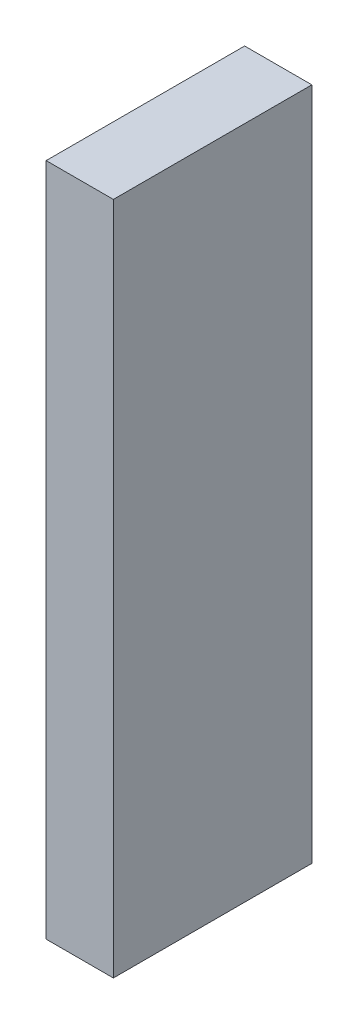
ISO-10303-21;
HEADER;
FILE_DESCRIPTION(('STEP AP214'),'2;1');
FILE_NAME('part.step','',(''),(''),'','','');
FILE_SCHEMA(('AUTOMOTIVE_DESIGN { 1 0 10303 214 1 1 1 1 }'));
ENDSEC;
DATA;
#1=APPLICATION_CONTEXT('core data for automotive mechanical design processes');
#2=APPLICATION_PROTOCOL_DEFINITION('international standard','automotive_design',2000,#1);
#3=PRODUCT_CONTEXT('',#1,'mechanical');
#4=PRODUCT('Part','Part','',(#3));
#5=PRODUCT_RELATED_PRODUCT_CATEGORY('part','',(#4));
#6=PRODUCT_DEFINITION_FORMATION('','',#4);
#7=PRODUCT_DEFINITION_CONTEXT('part definition',#1,'design');
#8=PRODUCT_DEFINITION('design','',#6,#7);
#9=PRODUCT_DEFINITION_SHAPE('','',#8);
#10=(LENGTH_UNIT() NAMED_UNIT(*) SI_UNIT(.MILLI.,.METRE.));
#11=(NAMED_UNIT(*) PLANE_ANGLE_UNIT() SI_UNIT($,.RADIAN.));
#12=(NAMED_UNIT(*) SI_UNIT($,.STERADIAN.) SOLID_ANGLE_UNIT());
#13=UNCERTAINTY_MEASURE_WITH_UNIT(LENGTH_MEASURE(1.E-05),#10,'distance_accuracy_value','');
#14=(GEOMETRIC_REPRESENTATION_CONTEXT(3) GLOBAL_UNCERTAINTY_ASSIGNED_CONTEXT((#13)) GLOBAL_UNIT_ASSIGNED_CONTEXT((#10,
#11,#12)) REPRESENTATION_CONTEXT('',''));
#15=CARTESIAN_POINT('',(0.,0.,0.));
#16=DIRECTION('',(0.,0.,1.));
#17=DIRECTION('',(1.,0.,0.));
#18=AXIS2_PLACEMENT_3D('',#15,#16,#17);
#19=CARTESIAN_POINT('',(-1.01595936,-10.1917754,0.));
#20=DIRECTION('',(-1.,0.,0.));
#21=DIRECTION('',(0.,0.,1.));
#22=AXIS2_PLACEMENT_3D('',#19,#20,#21);
#23=PLANE('',#22);
#24=DIRECTION('',(0.,0.,1.));
#25=VECTOR('',#24,1.);
#26=CARTESIAN_POINT('',(-1.01595936,10.19177794,0.));
#27=LINE('',#26,#25);
#28=CARTESIAN_POINT('',(-1.01595936,10.19177794,0.));
#29=VERTEX_POINT('',#28);
#30=CARTESIAN_POINT('',(-1.01595936,10.19177794,6.0000007));
#31=VERTEX_POINT('',#30);
#32=EDGE_CURVE('E20',#29,#31,#27,.T.);
#33=ORIENTED_EDGE('',*,*,#32,.F.);
#34=DIRECTION('',(0.,1.,0.));
#35=VECTOR('',#34,1.);
#36=CARTESIAN_POINT('',(-1.01595936,10.19177794,0.));
#37=LINE('',#36,#35);
#38=CARTESIAN_POINT('',(-1.01595936,-10.1917754,0.));
#39=VERTEX_POINT('',#38);
#40=EDGE_CURVE('E79',#29,#39,#37,.F.);
#41=ORIENTED_EDGE('',*,*,#40,.T.);
#42=DIRECTION('',(0.,0.,-1.));
#43=VECTOR('',#42,1.);
#44=CARTESIAN_POINT('',(-1.01595936,-10.1917754,0.));
#45=LINE('',#44,#43);
#46=CARTESIAN_POINT('',(-1.01595936,-10.1917754,6.0000007));
#47=VERTEX_POINT('',#46);
#48=EDGE_CURVE('E61',#47,#39,#45,.T.);
#49=ORIENTED_EDGE('',*,*,#48,.F.);
#50=DIRECTION('',(0.,1.,0.));
#51=VECTOR('',#50,1.);
#52=CARTESIAN_POINT('',(-1.01595936,10.19177794,6.0000007));
#53=LINE('',#52,#51);
#54=EDGE_CURVE('E56',#31,#47,#53,.F.);
#55=ORIENTED_EDGE('',*,*,#54,.F.);
#56=EDGE_LOOP('',(#33,#41,#49,#55));
#57=FACE_BOUND('',#56,.T.);
#58=ADVANCED_FACE('F17',(#57),#23,.T.);
#59=CARTESIAN_POINT('',(-1.01595936,10.19177794,0.));
#60=DIRECTION('',(0.,1.,0.));
#61=DIRECTION('',(0.,0.,1.));
#62=AXIS2_PLACEMENT_3D('',#59,#60,#61);
#63=PLANE('',#62);
#64=DIRECTION('',(0.,0.,-1.));
#65=VECTOR('',#64,1.);
#66=CARTESIAN_POINT('',(1.01595936,10.19177794,0.));
#67=LINE('',#66,#65);
#68=CARTESIAN_POINT('',(1.01595936,10.19177794,0.));
#69=VERTEX_POINT('',#68);
#70=CARTESIAN_POINT('',(1.01595936,10.19177794,6.0000007));
#71=VERTEX_POINT('',#70);
#72=EDGE_CURVE('E83',#69,#71,#67,.F.);
#73=ORIENTED_EDGE('',*,*,#72,.F.);
#74=DIRECTION('',(1.,0.,0.));
#75=VECTOR('',#74,1.);
#76=CARTESIAN_POINT('',(-1.01595936,10.19177794,0.));
#77=LINE('',#76,#75);
#78=EDGE_CURVE('E68',#69,#29,#77,.F.);
#79=ORIENTED_EDGE('',*,*,#78,.T.);
#80=ORIENTED_EDGE('',*,*,#32,.T.);
#81=DIRECTION('',(1.,0.,0.));
#82=VECTOR('',#81,1.);
#83=CARTESIAN_POINT('',(-1.01595936,10.19177794,6.0000007));
#84=LINE('',#83,#82);
#85=EDGE_CURVE('E63',#71,#31,#84,.F.);
#86=ORIENTED_EDGE('',*,*,#85,.F.);
#87=EDGE_LOOP('',(#73,#79,#80,#86));
#88=FACE_BOUND('',#87,.T.);
#89=ADVANCED_FACE('F65',(#88),#63,.T.);
#90=CARTESIAN_POINT('',(-1.01595936,10.19177794,6.0000007));
#91=DIRECTION('',(0.,0.,1.));
#92=DIRECTION('',(1.,0.,0.));
#93=AXIS2_PLACEMENT_3D('',#90,#91,#92);
#94=PLANE('',#93);
#95=DIRECTION('',(0.,1.,0.));
#96=VECTOR('',#95,1.);
#97=CARTESIAN_POINT('',(1.01595936,10.19177794,6.0000007));
#98=LINE('',#97,#96);
#99=CARTESIAN_POINT('',(1.01595936,-10.1917754,6.0000007));
#100=VERTEX_POINT('',#99);
#101=EDGE_CURVE('E72',#71,#100,#98,.F.);
#102=ORIENTED_EDGE('',*,*,#101,.F.);
#103=ORIENTED_EDGE('',*,*,#85,.T.);
#104=ORIENTED_EDGE('',*,*,#54,.T.);
#105=DIRECTION('',(1.,0.,0.));
#106=VECTOR('',#105,1.);
#107=CARTESIAN_POINT('',(1.01595936,-10.1917754,6.0000007));
#108=LINE('',#107,#106);
#109=EDGE_CURVE('E74',#100,#47,#108,.F.);
#110=ORIENTED_EDGE('',*,*,#109,.F.);
#111=EDGE_LOOP('',(#102,#103,#104,#110));
#112=FACE_BOUND('',#111,.T.);
#113=ADVANCED_FACE('F70',(#112),#94,.T.);
#114=CARTESIAN_POINT('',(1.01595936,-10.1917754,0.));
#115=DIRECTION('',(0.,-1.,0.));
#116=DIRECTION('',(0.,0.,-1.));
#117=AXIS2_PLACEMENT_3D('',#114,#115,#116);
#118=PLANE('',#117);
#119=ORIENTED_EDGE('',*,*,#48,.T.);
#120=DIRECTION('',(1.,0.,0.));
#121=VECTOR('',#120,1.);
#122=CARTESIAN_POINT('',(-1.01595936,-10.1917754,0.));
#123=LINE('',#122,#121);
#124=CARTESIAN_POINT('',(1.01595936,-10.1917754,0.));
#125=VERTEX_POINT('',#124);
#126=EDGE_CURVE('E35',#39,#125,#123,.T.);
#127=ORIENTED_EDGE('',*,*,#126,.T.);
#128=DIRECTION('',(0.,0.,-1.));
#129=VECTOR('',#128,1.);
#130=CARTESIAN_POINT('',(1.01595936,-10.1917754,0.));
#131=LINE('',#130,#129);
#132=EDGE_CURVE('E26',#100,#125,#131,.T.);
#133=ORIENTED_EDGE('',*,*,#132,.F.);
#134=ORIENTED_EDGE('',*,*,#109,.T.);
#135=EDGE_LOOP('',(#119,#127,#133,#134));
#136=FACE_BOUND('',#135,.T.);
#137=ADVANCED_FACE('F89',(#136),#118,.T.);
#138=CARTESIAN_POINT('',(-1.01595936,10.19177794,0.));
#139=DIRECTION('',(0.,0.,1.));
#140=DIRECTION('',(1.,0.,0.));
#141=AXIS2_PLACEMENT_3D('',#138,#139,#140);
#142=PLANE('',#141);
#143=DIRECTION('',(0.,1.,0.));
#144=VECTOR('',#143,1.);
#145=CARTESIAN_POINT('',(1.01595936,10.19177794,0.));
#146=LINE('',#145,#144);
#147=EDGE_CURVE('E11',#125,#69,#146,.T.);
#148=ORIENTED_EDGE('',*,*,#147,.F.);
#149=ORIENTED_EDGE('',*,*,#126,.F.);
#150=ORIENTED_EDGE('',*,*,#40,.F.);
#151=ORIENTED_EDGE('',*,*,#78,.F.);
#152=EDGE_LOOP('',(#148,#149,#150,#151));
#153=FACE_BOUND('',#152,.T.);
#154=ADVANCED_FACE('F91',(#153),#142,.F.);
#155=CARTESIAN_POINT('',(1.01595936,10.19177794,0.));
#156=DIRECTION('',(1.,0.,0.));
#157=DIRECTION('',(0.,0.,-1.));
#158=AXIS2_PLACEMENT_3D('',#155,#156,#157);
#159=PLANE('',#158);
#160=ORIENTED_EDGE('',*,*,#132,.T.);
#161=ORIENTED_EDGE('',*,*,#147,.T.);
#162=ORIENTED_EDGE('',*,*,#72,.T.);
#163=ORIENTED_EDGE('',*,*,#101,.T.);
#164=EDGE_LOOP('',(#160,#161,#162,#163));
#165=FACE_BOUND('',#164,.T.);
#166=ADVANCED_FACE('F88',(#165),#159,.T.);
#167=CLOSED_SHELL('',(#58,#89,#113,#137,#154,#166));
#168=MANIFOLD_SOLID_BREP('B1',#167);
#169=ADVANCED_BREP_SHAPE_REPRESENTATION('',(#18,#168),#14);
#170=SHAPE_DEFINITION_REPRESENTATION(#9,#169);
ENDSEC;
END-ISO-10303-21;
